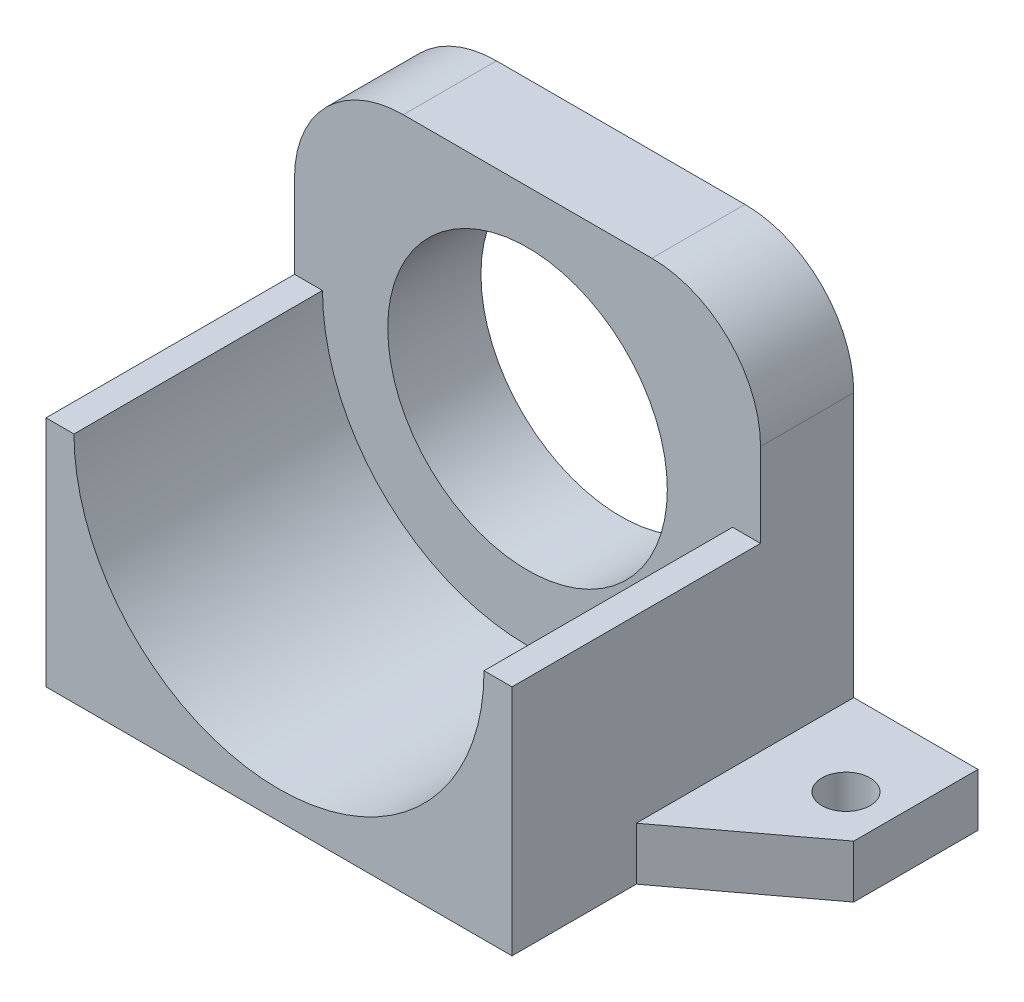
ISO-10303-21;
HEADER;
FILE_DESCRIPTION(('STEP AP214'),'2;1');
FILE_NAME('part.step','',(''),(''),'','','');
FILE_SCHEMA(('AUTOMOTIVE_DESIGN { 1 0 10303 214 1 1 1 1 }'));
ENDSEC;
DATA;
#1=APPLICATION_CONTEXT('core data for automotive mechanical design processes');
#2=APPLICATION_PROTOCOL_DEFINITION('international standard','automotive_design',2000,#1);
#3=PRODUCT_CONTEXT('',#1,'mechanical');
#4=PRODUCT('Part','Part','',(#3));
#5=PRODUCT_RELATED_PRODUCT_CATEGORY('part','',(#4));
#6=PRODUCT_DEFINITION_FORMATION('','',#4);
#7=PRODUCT_DEFINITION_CONTEXT('part definition',#1,'design');
#8=PRODUCT_DEFINITION('design','',#6,#7);
#9=PRODUCT_DEFINITION_SHAPE('','',#8);
#10=(LENGTH_UNIT() NAMED_UNIT(*) SI_UNIT(.MILLI.,.METRE.));
#11=(NAMED_UNIT(*) PLANE_ANGLE_UNIT() SI_UNIT($,.RADIAN.));
#12=(NAMED_UNIT(*) SI_UNIT($,.STERADIAN.) SOLID_ANGLE_UNIT());
#13=UNCERTAINTY_MEASURE_WITH_UNIT(LENGTH_MEASURE(1.E-05),#10,'distance_accuracy_value','');
#14=(GEOMETRIC_REPRESENTATION_CONTEXT(3) GLOBAL_UNCERTAINTY_ASSIGNED_CONTEXT((#13)) GLOBAL_UNIT_ASSIGNED_CONTEXT((#10,
#11,#12)) REPRESENTATION_CONTEXT('',''));
#15=CARTESIAN_POINT('',(0.,0.,0.));
#16=DIRECTION('',(0.,0.,1.));
#17=DIRECTION('',(1.,0.,0.));
#18=AXIS2_PLACEMENT_3D('',#15,#16,#17);
#19=CARTESIAN_POINT('',(15.,27.4,6.));
#20=DIRECTION('',(-1.,0.,0.));
#21=DIRECTION('',(0.,-1.,0.));
#22=AXIS2_PLACEMENT_3D('',#19,#20,#21);
#23=PLANE('',#22);
#24=DIRECTION('',(0.,-1.,0.));
#25=VECTOR('',#24,1.);
#26=CARTESIAN_POINT('',(15.,13.4,14.));
#27=LINE('',#26,#25);
#28=CARTESIAN_POINT('',(15.,3.4,14.));
#29=VERTEX_POINT('',#28);
#30=CARTESIAN_POINT('',(15.,0.,14.));
#31=VERTEX_POINT('',#30);
#32=EDGE_CURVE('E185',#29,#31,#27,.T.);
#33=ORIENTED_EDGE('',*,*,#32,.F.);
#34=DIRECTION('',(0.,0.,-1.));
#35=VECTOR('',#34,1.);
#36=CARTESIAN_POINT('',(15.,3.4,6.));
#37=LINE('',#36,#35);
#38=CARTESIAN_POINT('',(15.,3.4,0.));
#39=VERTEX_POINT('',#38);
#40=EDGE_CURVE('E48',#29,#39,#37,.T.);
#41=ORIENTED_EDGE('',*,*,#40,.T.);
#42=DIRECTION('',(0.,1.,0.));
#43=VECTOR('',#42,1.);
#44=CARTESIAN_POINT('',(15.,27.4,0.));
#45=LINE('',#44,#43);
#46=CARTESIAN_POINT('',(15.,20.4,0.));
#47=VERTEX_POINT('',#46);
#48=EDGE_CURVE('E256',#39,#47,#45,.T.);
#49=ORIENTED_EDGE('',*,*,#48,.T.);
#50=DIRECTION('',(0.,0.,-1.));
#51=VECTOR('',#50,1.);
#52=CARTESIAN_POINT('',(15.,20.4,6.));
#53=LINE('',#52,#51);
#54=CARTESIAN_POINT('',(15.,20.4,6.));
#55=VERTEX_POINT('',#54);
#56=EDGE_CURVE('E11',#47,#55,#53,.F.);
#57=ORIENTED_EDGE('',*,*,#56,.T.);
#58=DIRECTION('',(0.,1.,0.));
#59=VECTOR('',#58,1.);
#60=CARTESIAN_POINT('',(15.,27.4,6.));
#61=LINE('',#60,#59);
#62=CARTESIAN_POINT('',(15.,15.,6.));
#63=VERTEX_POINT('',#62);
#64=EDGE_CURVE('E243',#63,#55,#61,.T.);
#65=ORIENTED_EDGE('',*,*,#64,.F.);
#66=DIRECTION('',(0.,0.,-1.));
#67=VECTOR('',#66,1.);
#68=CARTESIAN_POINT('',(15.,15.,22.));
#69=LINE('',#68,#67);
#70=CARTESIAN_POINT('',(15.,15.,22.));
#71=VERTEX_POINT('',#70);
#72=EDGE_CURVE('E229',#71,#63,#69,.T.);
#73=ORIENTED_EDGE('',*,*,#72,.F.);
#74=DIRECTION('',(0.,1.,0.));
#75=VECTOR('',#74,1.);
#76=CARTESIAN_POINT('',(15.,0.,22.));
#77=LINE('',#76,#75);
#78=CARTESIAN_POINT('',(15.,0.,22.));
#79=VERTEX_POINT('',#78);
#80=EDGE_CURVE('E205',#79,#71,#77,.T.);
#81=ORIENTED_EDGE('',*,*,#80,.F.);
#82=DIRECTION('',(0.,0.,-1.));
#83=VECTOR('',#82,1.);
#84=CARTESIAN_POINT('',(15.,0.,22.));
#85=LINE('',#84,#83);
#86=EDGE_CURVE('E55',#79,#31,#85,.T.);
#87=ORIENTED_EDGE('',*,*,#86,.T.);
#88=EDGE_LOOP('',(#33,#41,#49,#57,#65,#73,#81,#87));
#89=FACE_BOUND('',#88,.T.);
#90=ADVANCED_FACE('F33',(#89),#23,.F.);
#91=CARTESIAN_POINT('',(-15.,3.4,6.));
#92=DIRECTION('',(1.,0.,0.));
#93=DIRECTION('',(0.,1.,0.));
#94=AXIS2_PLACEMENT_3D('',#91,#92,#93);
#95=PLANE('',#94);
#96=DIRECTION('',(0.,-1.,0.));
#97=VECTOR('',#96,1.);
#98=CARTESIAN_POINT('',(-15.,13.4,14.));
#99=LINE('',#98,#97);
#100=CARTESIAN_POINT('',(-15.,3.4,14.));
#101=VERTEX_POINT('',#100);
#102=CARTESIAN_POINT('',(-15.,0.,14.));
#103=VERTEX_POINT('',#102);
#104=EDGE_CURVE('E175',#101,#103,#99,.T.);
#105=ORIENTED_EDGE('',*,*,#104,.T.);
#106=DIRECTION('',(0.,0.,-1.));
#107=VECTOR('',#106,1.);
#108=CARTESIAN_POINT('',(-15.,0.,22.));
#109=LINE('',#108,#107);
#110=CARTESIAN_POINT('',(-15.,0.,22.));
#111=VERTEX_POINT('',#110);
#112=EDGE_CURVE('E233',#111,#103,#109,.T.);
#113=ORIENTED_EDGE('',*,*,#112,.F.);
#114=DIRECTION('',(0.,-1.,0.));
#115=VECTOR('',#114,1.);
#116=CARTESIAN_POINT('',(-15.,0.,22.));
#117=LINE('',#116,#115);
#118=CARTESIAN_POINT('',(-15.,15.,22.));
#119=VERTEX_POINT('',#118);
#120=EDGE_CURVE('E199',#119,#111,#117,.T.);
#121=ORIENTED_EDGE('',*,*,#120,.F.);
#122=DIRECTION('',(0.,0.,-1.));
#123=VECTOR('',#122,1.);
#124=CARTESIAN_POINT('',(-15.,15.,22.));
#125=LINE('',#124,#123);
#126=CARTESIAN_POINT('',(-15.,15.,6.));
#127=VERTEX_POINT('',#126);
#128=EDGE_CURVE('E213',#119,#127,#125,.T.);
#129=ORIENTED_EDGE('',*,*,#128,.T.);
#130=DIRECTION('',(0.,-1.,0.));
#131=VECTOR('',#130,1.);
#132=CARTESIAN_POINT('',(-15.,3.4,6.));
#133=LINE('',#132,#131);
#134=CARTESIAN_POINT('',(-15.,20.4,6.));
#135=VERTEX_POINT('',#134);
#136=EDGE_CURVE('E172',#135,#127,#133,.T.);
#137=ORIENTED_EDGE('',*,*,#136,.F.);
#138=DIRECTION('',(0.,0.,-1.));
#139=VECTOR('',#138,1.);
#140=CARTESIAN_POINT('',(-15.,20.4,6.));
#141=LINE('',#140,#139);
#142=CARTESIAN_POINT('',(-15.,20.4,0.));
#143=VERTEX_POINT('',#142);
#144=EDGE_CURVE('E274',#135,#143,#141,.T.);
#145=ORIENTED_EDGE('',*,*,#144,.T.);
#146=DIRECTION('',(0.,-1.,0.));
#147=VECTOR('',#146,1.);
#148=CARTESIAN_POINT('',(-15.,3.4,0.));
#149=LINE('',#148,#147);
#150=CARTESIAN_POINT('',(-15.,3.4,0.));
#151=VERTEX_POINT('',#150);
#152=EDGE_CURVE('E262',#143,#151,#149,.T.);
#153=ORIENTED_EDGE('',*,*,#152,.T.);
#154=DIRECTION('',(0.,0.,-1.));
#155=VECTOR('',#154,1.);
#156=CARTESIAN_POINT('',(-15.,3.4,6.));
#157=LINE('',#156,#155);
#158=EDGE_CURVE('E171',#101,#151,#157,.T.);
#159=ORIENTED_EDGE('',*,*,#158,.F.);
#160=EDGE_LOOP('',(#105,#113,#121,#129,#137,#145,#153,#159));
#161=FACE_BOUND('',#160,.T.);
#162=ADVANCED_FACE('F296',(#161),#95,.F.);
#163=CARTESIAN_POINT('',(0.,0.,6.));
#164=DIRECTION('',(0.,0.,-1.));
#165=DIRECTION('',(-1.,0.,0.));
#166=AXIS2_PLACEMENT_3D('',#163,#164,#165);
#167=PLANE('',#166);
#168=CARTESIAN_POINT('',(0.,15.,6.));
#169=DIRECTION('',(0.,0.,-1.));
#170=DIRECTION('',(-1.,0.,0.));
#171=AXIS2_PLACEMENT_3D('',#168,#169,#170);
#172=CIRCLE('',#171,9.);
#173=CARTESIAN_POINT('',(-9.,15.,6.));
#174=VERTEX_POINT('',#173);
#175=EDGE_CURVE('E239',#174,#174,#172,.F.);
#176=ORIENTED_EDGE('',*,*,#175,.F.);
#177=EDGE_LOOP('',(#176));
#178=FACE_BOUND('',#177,.T.);
#179=DIRECTION('',(-1.,0.,0.));
#180=VECTOR('',#179,1.);
#181=CARTESIAN_POINT('',(-15.,15.,6.));
#182=LINE('',#181,#180);
#183=CARTESIAN_POINT('',(-13.2,15.,6.));
#184=VERTEX_POINT('',#183);
#185=EDGE_CURVE('E203',#184,#127,#182,.T.);
#186=ORIENTED_EDGE('',*,*,#185,.F.);
#187=CARTESIAN_POINT('',(0.,15.,6.));
#188=DIRECTION('',(0.,0.,-1.));
#189=DIRECTION('',(1.,0.,0.));
#190=AXIS2_PLACEMENT_3D('',#187,#188,#189);
#191=CIRCLE('',#190,13.2);
#192=CARTESIAN_POINT('',(13.2,15.,6.));
#193=VERTEX_POINT('',#192);
#194=EDGE_CURVE('E216',#193,#184,#191,.T.);
#195=ORIENTED_EDGE('',*,*,#194,.F.);
#196=DIRECTION('',(-1.,0.,0.));
#197=VECTOR('',#196,1.);
#198=CARTESIAN_POINT('',(15.,15.,6.));
#199=LINE('',#198,#197);
#200=EDGE_CURVE('E160',#63,#193,#199,.T.);
#201=ORIENTED_EDGE('',*,*,#200,.F.);
#202=ORIENTED_EDGE('',*,*,#64,.T.);
#203=CARTESIAN_POINT('',(8.,20.4,6.));
#204=DIRECTION('',(0.,0.,-1.));
#205=DIRECTION('',(-1.,0.,0.));
#206=AXIS2_PLACEMENT_3D('',#203,#204,#205);
#207=CIRCLE('',#206,7.);
#208=CARTESIAN_POINT('',(8.,27.4,6.));
#209=VERTEX_POINT('',#208);
#210=EDGE_CURVE('E286',#55,#209,#207,.F.);
#211=ORIENTED_EDGE('',*,*,#210,.T.);
#212=DIRECTION('',(-1.,0.,0.));
#213=VECTOR('',#212,1.);
#214=CARTESIAN_POINT('',(-15.,27.4,6.));
#215=LINE('',#214,#213);
#216=CARTESIAN_POINT('',(-8.,27.4,6.));
#217=VERTEX_POINT('',#216);
#218=EDGE_CURVE('E245',#209,#217,#215,.T.);
#219=ORIENTED_EDGE('',*,*,#218,.T.);
#220=CARTESIAN_POINT('',(-8.,20.4,6.));
#221=DIRECTION('',(0.,0.,-1.));
#222=DIRECTION('',(-1.,0.,0.));
#223=AXIS2_PLACEMENT_3D('',#220,#221,#222);
#224=CIRCLE('',#223,7.);
#225=EDGE_CURVE('E41',#217,#135,#224,.F.);
#226=ORIENTED_EDGE('',*,*,#225,.T.);
#227=ORIENTED_EDGE('',*,*,#136,.T.);
#228=EDGE_LOOP('',(#186,#195,#201,#202,#211,#219,#226,#227));
#229=FACE_BOUND('',#228,.T.);
#230=ADVANCED_FACE('F290',(#178,#229),#167,.F.);
#231=CARTESIAN_POINT('',(-23.,0.,6.));
#232=DIRECTION('',(1.,0.,0.));
#233=DIRECTION('',(0.,0.,-1.));
#234=AXIS2_PLACEMENT_3D('',#231,#232,#233);
#235=PLANE('',#234);
#236=DIRECTION('',(0.,-1.,0.));
#237=VECTOR('',#236,1.);
#238=CARTESIAN_POINT('',(-23.,0.,0.));
#239=LINE('',#238,#237);
#240=CARTESIAN_POINT('',(-23.,3.4,0.));
#241=VERTEX_POINT('',#240);
#242=CARTESIAN_POINT('',(-23.,0.,0.));
#243=VERTEX_POINT('',#242);
#244=EDGE_CURVE('E242',#241,#243,#239,.T.);
#245=ORIENTED_EDGE('',*,*,#244,.T.);
#246=DIRECTION('',(0.,0.,-1.));
#247=VECTOR('',#246,1.);
#248=CARTESIAN_POINT('',(-23.,0.,6.));
#249=LINE('',#248,#247);
#250=CARTESIAN_POINT('',(-23.,0.,8.));
#251=VERTEX_POINT('',#250);
#252=EDGE_CURVE('E155',#251,#243,#249,.T.);
#253=ORIENTED_EDGE('',*,*,#252,.F.);
#254=DIRECTION('',(0.,-1.,0.));
#255=VECTOR('',#254,1.);
#256=CARTESIAN_POINT('',(-23.,3.4,8.));
#257=LINE('',#256,#255);
#258=CARTESIAN_POINT('',(-23.,3.4,8.));
#259=VERTEX_POINT('',#258);
#260=EDGE_CURVE('E148',#259,#251,#257,.T.);
#261=ORIENTED_EDGE('',*,*,#260,.F.);
#262=DIRECTION('',(0.,0.,-1.));
#263=VECTOR('',#262,1.);
#264=CARTESIAN_POINT('',(-23.,3.4,6.));
#265=LINE('',#264,#263);
#266=EDGE_CURVE('E152',#259,#241,#265,.T.);
#267=ORIENTED_EDGE('',*,*,#266,.T.);
#268=EDGE_LOOP('',(#245,#253,#261,#267));
#269=FACE_BOUND('',#268,.T.);
#270=ADVANCED_FACE('F151',(#269),#235,.F.);
#271=CARTESIAN_POINT('',(-23.,0.,6.));
#272=DIRECTION('',(0.,1.,0.));
#273=DIRECTION('',(0.,0.,1.));
#274=AXIS2_PLACEMENT_3D('',#271,#272,#273);
#275=PLANE('',#274);
#276=DIRECTION('',(0.8,0.,-0.6));
#277=VECTOR('',#276,1.);
#278=CARTESIAN_POINT('',(15.,0.,14.));
#279=LINE('',#278,#277);
#280=CARTESIAN_POINT('',(23.,0.,8.));
#281=VERTEX_POINT('',#280);
#282=EDGE_CURVE('E316',#31,#281,#279,.T.);
#283=ORIENTED_EDGE('',*,*,#282,.F.);
#284=ORIENTED_EDGE('',*,*,#86,.F.);
#285=DIRECTION('',(1.,0.,0.));
#286=VECTOR('',#285,1.);
#287=CARTESIAN_POINT('',(-15.,0.,22.));
#288=LINE('',#287,#286);
#289=EDGE_CURVE('E202',#111,#79,#288,.T.);
#290=ORIENTED_EDGE('',*,*,#289,.F.);
#291=ORIENTED_EDGE('',*,*,#112,.T.);
#292=DIRECTION('',(0.8,0.,0.6));
#293=VECTOR('',#292,1.);
#294=CARTESIAN_POINT('',(-23.,0.,8.));
#295=LINE('',#294,#293);
#296=EDGE_CURVE('E181',#251,#103,#295,.T.);
#297=ORIENTED_EDGE('',*,*,#296,.F.);
#298=ORIENTED_EDGE('',*,*,#252,.T.);
#299=DIRECTION('',(1.,0.,0.));
#300=VECTOR('',#299,1.);
#301=CARTESIAN_POINT('',(-23.,0.,0.));
#302=LINE('',#301,#300);
#303=CARTESIAN_POINT('',(23.,0.,0.));
#304=VERTEX_POINT('',#303);
#305=EDGE_CURVE('E250',#243,#304,#302,.T.);
#306=ORIENTED_EDGE('',*,*,#305,.T.);
#307=DIRECTION('',(0.,0.,-1.));
#308=VECTOR('',#307,1.);
#309=CARTESIAN_POINT('',(23.,0.,6.));
#310=LINE('',#309,#308);
#311=EDGE_CURVE('E270',#281,#304,#310,.T.);
#312=ORIENTED_EDGE('',*,*,#311,.F.);
#313=EDGE_LOOP('',(#283,#284,#290,#291,#297,#298,#306,#312));
#314=FACE_BOUND('',#313,.T.);
#315=CARTESIAN_POINT('',(20.,0.,5.5));
#316=DIRECTION('',(0.,1.,0.));
#317=DIRECTION('',(0.,0.,1.));
#318=AXIS2_PLACEMENT_3D('',#315,#316,#317);
#319=CIRCLE('',#318,1.55);
#320=CARTESIAN_POINT('',(20.,0.,7.05));
#321=VERTEX_POINT('',#320);
#322=EDGE_CURVE('E189',#321,#321,#319,.T.);
#323=ORIENTED_EDGE('',*,*,#322,.T.);
#324=EDGE_LOOP('',(#323));
#325=FACE_BOUND('',#324,.T.);
#326=CARTESIAN_POINT('',(-20.,0.,5.5));
#327=DIRECTION('',(0.,1.,0.));
#328=DIRECTION('',(0.,0.,1.));
#329=AXIS2_PLACEMENT_3D('',#326,#327,#328);
#330=CIRCLE('',#329,1.55);
#331=CARTESIAN_POINT('',(-20.,0.,7.05));
#332=VERTEX_POINT('',#331);
#333=EDGE_CURVE('E179',#332,#332,#330,.T.);
#334=ORIENTED_EDGE('',*,*,#333,.T.);
#335=EDGE_LOOP('',(#334));
#336=FACE_BOUND('',#335,.T.);
#337=ADVANCED_FACE('F321',(#314,#325,#336),#275,.F.);
#338=CARTESIAN_POINT('',(23.,0.,6.));
#339=DIRECTION('',(-1.,0.,0.));
#340=DIRECTION('',(0.,0.,1.));
#341=AXIS2_PLACEMENT_3D('',#338,#339,#340);
#342=PLANE('',#341);
#343=DIRECTION('',(0.,1.,0.));
#344=VECTOR('',#343,1.);
#345=CARTESIAN_POINT('',(23.,0.,0.));
#346=LINE('',#345,#344);
#347=CARTESIAN_POINT('',(23.,3.4,0.));
#348=VERTEX_POINT('',#347);
#349=EDGE_CURVE('E252',#304,#348,#346,.T.);
#350=ORIENTED_EDGE('',*,*,#349,.T.);
#351=DIRECTION('',(0.,0.,-1.));
#352=VECTOR('',#351,1.);
#353=CARTESIAN_POINT('',(23.,3.4,6.));
#354=LINE('',#353,#352);
#355=CARTESIAN_POINT('',(23.,3.4,8.));
#356=VERTEX_POINT('',#355);
#357=EDGE_CURVE('E267',#356,#348,#354,.T.);
#358=ORIENTED_EDGE('',*,*,#357,.F.);
#359=DIRECTION('',(0.,1.,0.));
#360=VECTOR('',#359,1.);
#361=CARTESIAN_POINT('',(23.,3.4,8.));
#362=LINE('',#361,#360);
#363=EDGE_CURVE('E161',#281,#356,#362,.T.);
#364=ORIENTED_EDGE('',*,*,#363,.F.);
#365=ORIENTED_EDGE('',*,*,#311,.T.);
#366=EDGE_LOOP('',(#350,#358,#364,#365));
#367=FACE_BOUND('',#366,.T.);
#368=ADVANCED_FACE('F325',(#367),#342,.F.);
#369=CARTESIAN_POINT('',(23.,3.4,6.));
#370=DIRECTION('',(0.,-1.,0.));
#371=DIRECTION('',(0.,0.,-1.));
#372=AXIS2_PLACEMENT_3D('',#369,#370,#371);
#373=PLANE('',#372);
#374=CARTESIAN_POINT('',(20.,3.4,5.5));
#375=DIRECTION('',(0.,1.,0.));
#376=DIRECTION('',(0.,0.,1.));
#377=AXIS2_PLACEMENT_3D('',#374,#375,#376);
#378=CIRCLE('',#377,1.55);
#379=CARTESIAN_POINT('',(20.,3.4,7.05));
#380=VERTEX_POINT('',#379);
#381=EDGE_CURVE('E192',#380,#380,#378,.T.);
#382=ORIENTED_EDGE('',*,*,#381,.F.);
#383=EDGE_LOOP('',(#382));
#384=FACE_BOUND('',#383,.T.);
#385=DIRECTION('',(-1.,0.,0.));
#386=VECTOR('',#385,1.);
#387=CARTESIAN_POINT('',(23.,3.4,0.));
#388=LINE('',#387,#386);
#389=EDGE_CURVE('E254',#348,#39,#388,.T.);
#390=ORIENTED_EDGE('',*,*,#389,.T.);
#391=ORIENTED_EDGE('',*,*,#40,.F.);
#392=DIRECTION('',(-0.8,0.,0.6));
#393=VECTOR('',#392,1.);
#394=CARTESIAN_POINT('',(15.,3.4,14.));
#395=LINE('',#394,#393);
#396=EDGE_CURVE('E187',#356,#29,#395,.T.);
#397=ORIENTED_EDGE('',*,*,#396,.F.);
#398=ORIENTED_EDGE('',*,*,#357,.T.);
#399=EDGE_LOOP('',(#390,#391,#397,#398));
#400=FACE_BOUND('',#399,.T.);
#401=ADVANCED_FACE('F326',(#384,#400),#373,.F.);
#402=CARTESIAN_POINT('',(-15.,27.4,6.));
#403=DIRECTION('',(0.,-1.,0.));
#404=DIRECTION('',(0.,0.,-1.));
#405=AXIS2_PLACEMENT_3D('',#402,#403,#404);
#406=PLANE('',#405);
#407=DIRECTION('',(-1.,0.,0.));
#408=VECTOR('',#407,1.);
#409=CARTESIAN_POINT('',(-15.,27.4,0.));
#410=LINE('',#409,#408);
#411=CARTESIAN_POINT('',(8.,27.4,0.));
#412=VERTEX_POINT('',#411);
#413=CARTESIAN_POINT('',(-8.,27.4,0.));
#414=VERTEX_POINT('',#413);
#415=EDGE_CURVE('E259',#412,#414,#410,.T.);
#416=ORIENTED_EDGE('',*,*,#415,.T.);
#417=DIRECTION('',(0.,0.,-1.));
#418=VECTOR('',#417,1.);
#419=CARTESIAN_POINT('',(-8.,27.4,6.));
#420=LINE('',#419,#418);
#421=EDGE_CURVE('E284',#414,#217,#420,.F.);
#422=ORIENTED_EDGE('',*,*,#421,.T.);
#423=ORIENTED_EDGE('',*,*,#218,.F.);
#424=DIRECTION('',(0.,0.,-1.));
#425=VECTOR('',#424,1.);
#426=CARTESIAN_POINT('',(8.,27.4,6.));
#427=LINE('',#426,#425);
#428=EDGE_CURVE('E281',#209,#412,#427,.T.);
#429=ORIENTED_EDGE('',*,*,#428,.T.);
#430=EDGE_LOOP('',(#416,#422,#423,#429));
#431=FACE_BOUND('',#430,.T.);
#432=ADVANCED_FACE('F305',(#431),#406,.F.);
#433=CARTESIAN_POINT('',(-23.,3.4,6.));
#434=DIRECTION('',(0.,-1.,0.));
#435=DIRECTION('',(0.,0.,-1.));
#436=AXIS2_PLACEMENT_3D('',#433,#434,#435);
#437=PLANE('',#436);
#438=CARTESIAN_POINT('',(-20.,3.4,5.5));
#439=DIRECTION('',(0.,1.,0.));
#440=DIRECTION('',(0.,0.,1.));
#441=AXIS2_PLACEMENT_3D('',#438,#439,#440);
#442=CIRCLE('',#441,1.55);
#443=CARTESIAN_POINT('',(-20.,3.4,7.05));
#444=VERTEX_POINT('',#443);
#445=EDGE_CURVE('E176',#444,#444,#442,.T.);
#446=ORIENTED_EDGE('',*,*,#445,.F.);
#447=EDGE_LOOP('',(#446));
#448=FACE_BOUND('',#447,.T.);
#449=DIRECTION('',(-1.,0.,0.));
#450=VECTOR('',#449,1.);
#451=CARTESIAN_POINT('',(-23.,3.4,0.));
#452=LINE('',#451,#450);
#453=EDGE_CURVE('E170',#151,#241,#452,.T.);
#454=ORIENTED_EDGE('',*,*,#453,.T.);
#455=ORIENTED_EDGE('',*,*,#266,.F.);
#456=DIRECTION('',(-0.8,0.,-0.6));
#457=VECTOR('',#456,1.);
#458=CARTESIAN_POINT('',(-23.,3.4,8.));
#459=LINE('',#458,#457);
#460=EDGE_CURVE('E167',#101,#259,#459,.T.);
#461=ORIENTED_EDGE('',*,*,#460,.F.);
#462=ORIENTED_EDGE('',*,*,#158,.T.);
#463=EDGE_LOOP('',(#454,#455,#461,#462));
#464=FACE_BOUND('',#463,.T.);
#465=ADVANCED_FACE('F165',(#448,#464),#437,.F.);
#466=CARTESIAN_POINT('',(0.,0.,0.));
#467=DIRECTION('',(0.,0.,-1.));
#468=DIRECTION('',(-1.,0.,0.));
#469=AXIS2_PLACEMENT_3D('',#466,#467,#468);
#470=PLANE('',#469);
#471=CARTESIAN_POINT('',(0.,15.,0.));
#472=DIRECTION('',(0.,0.,-1.));
#473=DIRECTION('',(-1.,0.,0.));
#474=AXIS2_PLACEMENT_3D('',#471,#472,#473);
#475=CIRCLE('',#474,9.);
#476=CARTESIAN_POINT('',(-9.,15.,0.));
#477=VERTEX_POINT('',#476);
#478=EDGE_CURVE('E236',#477,#477,#475,.T.);
#479=ORIENTED_EDGE('',*,*,#478,.F.);
#480=EDGE_LOOP('',(#479));
#481=FACE_BOUND('',#480,.T.);
#482=ORIENTED_EDGE('',*,*,#152,.F.);
#483=CARTESIAN_POINT('',(-8.,20.4,0.));
#484=DIRECTION('',(0.,0.,-1.));
#485=DIRECTION('',(-1.,0.,0.));
#486=AXIS2_PLACEMENT_3D('',#483,#484,#485);
#487=CIRCLE('',#486,7.);
#488=EDGE_CURVE('E279',#143,#414,#487,.T.);
#489=ORIENTED_EDGE('',*,*,#488,.T.);
#490=ORIENTED_EDGE('',*,*,#415,.F.);
#491=CARTESIAN_POINT('',(8.,20.4,0.));
#492=DIRECTION('',(0.,0.,-1.));
#493=DIRECTION('',(-1.,0.,0.));
#494=AXIS2_PLACEMENT_3D('',#491,#492,#493);
#495=CIRCLE('',#494,7.);
#496=EDGE_CURVE('E277',#412,#47,#495,.T.);
#497=ORIENTED_EDGE('',*,*,#496,.T.);
#498=ORIENTED_EDGE('',*,*,#48,.F.);
#499=ORIENTED_EDGE('',*,*,#389,.F.);
#500=ORIENTED_EDGE('',*,*,#349,.F.);
#501=ORIENTED_EDGE('',*,*,#305,.F.);
#502=ORIENTED_EDGE('',*,*,#244,.F.);
#503=ORIENTED_EDGE('',*,*,#453,.F.);
#504=EDGE_LOOP('',(#482,#489,#490,#497,#498,#499,#500,#501,#502,#503));
#505=FACE_BOUND('',#504,.T.);
#506=ADVANCED_FACE('F303',(#481,#505),#470,.T.);
#507=CARTESIAN_POINT('',(0.,15.,31.4558441227157));
#508=DIRECTION('',(0.,0.,-1.));
#509=DIRECTION('',(-1.,0.,0.));
#510=AXIS2_PLACEMENT_3D('',#507,#508,#509);
#511=CYLINDRICAL_SURFACE('',#510,9.);
#512=ORIENTED_EDGE('',*,*,#175,.T.);
#513=EDGE_LOOP('',(#512));
#514=FACE_BOUND('',#513,.T.);
#515=ORIENTED_EDGE('',*,*,#478,.T.);
#516=EDGE_LOOP('',(#515));
#517=FACE_BOUND('',#516,.T.);
#518=ADVANCED_FACE('F368',(#514,#517),#511,.F.);
#519=CARTESIAN_POINT('',(-8.,20.4,6.));
#520=DIRECTION('',(0.,0.,-1.));
#521=DIRECTION('',(-1.,0.,0.));
#522=AXIS2_PLACEMENT_3D('',#519,#520,#521);
#523=CYLINDRICAL_SURFACE('',#522,7.);
#524=ORIENTED_EDGE('',*,*,#225,.F.);
#525=ORIENTED_EDGE('',*,*,#421,.F.);
#526=ORIENTED_EDGE('',*,*,#488,.F.);
#527=ORIENTED_EDGE('',*,*,#144,.F.);
#528=EDGE_LOOP('',(#524,#525,#526,#527));
#529=FACE_BOUND('',#528,.T.);
#530=ADVANCED_FACE('F300',(#529),#523,.T.);
#531=CARTESIAN_POINT('',(8.,20.4,6.));
#532=DIRECTION('',(0.,0.,-1.));
#533=DIRECTION('',(-1.,0.,0.));
#534=AXIS2_PLACEMENT_3D('',#531,#532,#533);
#535=CYLINDRICAL_SURFACE('',#534,7.);
#536=ORIENTED_EDGE('',*,*,#210,.F.);
#537=ORIENTED_EDGE('',*,*,#56,.F.);
#538=ORIENTED_EDGE('',*,*,#496,.F.);
#539=ORIENTED_EDGE('',*,*,#428,.F.);
#540=EDGE_LOOP('',(#536,#537,#538,#539));
#541=FACE_BOUND('',#540,.T.);
#542=ADVANCED_FACE('F35',(#541),#535,.T.);
#543=CARTESIAN_POINT('',(15.,15.,22.));
#544=DIRECTION('',(0.,-1.,0.));
#545=DIRECTION('',(0.,0.,-1.));
#546=AXIS2_PLACEMENT_3D('',#543,#544,#545);
#547=PLANE('',#546);
#548=ORIENTED_EDGE('',*,*,#200,.T.);
#549=DIRECTION('',(0.,0.,-1.));
#550=VECTOR('',#549,1.);
#551=CARTESIAN_POINT('',(13.2,15.,22.));
#552=LINE('',#551,#550);
#553=CARTESIAN_POINT('',(13.2,15.,22.));
#554=VERTEX_POINT('',#553);
#555=EDGE_CURVE('E226',#554,#193,#552,.T.);
#556=ORIENTED_EDGE('',*,*,#555,.F.);
#557=DIRECTION('',(-1.,0.,0.));
#558=VECTOR('',#557,1.);
#559=CARTESIAN_POINT('',(15.,15.,22.));
#560=LINE('',#559,#558);
#561=EDGE_CURVE('E207',#71,#554,#560,.T.);
#562=ORIENTED_EDGE('',*,*,#561,.F.);
#563=ORIENTED_EDGE('',*,*,#72,.T.);
#564=EDGE_LOOP('',(#548,#556,#562,#563));
#565=FACE_BOUND('',#564,.T.);
#566=ADVANCED_FACE('F341',(#565),#547,.F.);
#567=CARTESIAN_POINT('',(0.,15.,22.));
#568=DIRECTION('',(0.,0.,-1.));
#569=DIRECTION('',(-1.,0.,0.));
#570=AXIS2_PLACEMENT_3D('',#567,#568,#569);
#571=CYLINDRICAL_SURFACE('',#570,13.2);
#572=ORIENTED_EDGE('',*,*,#194,.T.);
#573=DIRECTION('',(0.,0.,-1.));
#574=VECTOR('',#573,1.);
#575=CARTESIAN_POINT('',(-13.2,15.,22.));
#576=LINE('',#575,#574);
#577=CARTESIAN_POINT('',(-13.2,15.,22.));
#578=VERTEX_POINT('',#577);
#579=EDGE_CURVE('E223',#578,#184,#576,.T.);
#580=ORIENTED_EDGE('',*,*,#579,.F.);
#581=CARTESIAN_POINT('',(0.,15.,22.));
#582=DIRECTION('',(0.,0.,-1.));
#583=DIRECTION('',(1.,0.,0.));
#584=AXIS2_PLACEMENT_3D('',#581,#582,#583);
#585=CIRCLE('',#584,13.2);
#586=EDGE_CURVE('E209',#554,#578,#585,.T.);
#587=ORIENTED_EDGE('',*,*,#586,.F.);
#588=ORIENTED_EDGE('',*,*,#555,.T.);
#589=EDGE_LOOP('',(#572,#580,#587,#588));
#590=FACE_BOUND('',#589,.T.);
#591=ADVANCED_FACE('F337',(#590),#571,.F.);
#592=CARTESIAN_POINT('',(-15.,15.,22.));
#593=DIRECTION('',(0.,-1.,0.));
#594=DIRECTION('',(0.,0.,-1.));
#595=AXIS2_PLACEMENT_3D('',#592,#593,#594);
#596=PLANE('',#595);
#597=ORIENTED_EDGE('',*,*,#185,.T.);
#598=ORIENTED_EDGE('',*,*,#128,.F.);
#599=DIRECTION('',(-1.,0.,0.));
#600=VECTOR('',#599,1.);
#601=CARTESIAN_POINT('',(-15.,15.,22.));
#602=LINE('',#601,#600);
#603=EDGE_CURVE('E211',#578,#119,#602,.T.);
#604=ORIENTED_EDGE('',*,*,#603,.F.);
#605=ORIENTED_EDGE('',*,*,#579,.T.);
#606=EDGE_LOOP('',(#597,#598,#604,#605));
#607=FACE_BOUND('',#606,.T.);
#608=ADVANCED_FACE('F334',(#607),#596,.F.);
#609=CARTESIAN_POINT('',(0.,15.,22.));
#610=DIRECTION('',(0.,0.,1.));
#611=DIRECTION('',(1.,0.,0.));
#612=AXIS2_PLACEMENT_3D('',#609,#610,#611);
#613=PLANE('',#612);
#614=ORIENTED_EDGE('',*,*,#120,.T.);
#615=ORIENTED_EDGE('',*,*,#289,.T.);
#616=ORIENTED_EDGE('',*,*,#80,.T.);
#617=ORIENTED_EDGE('',*,*,#561,.T.);
#618=ORIENTED_EDGE('',*,*,#586,.T.);
#619=ORIENTED_EDGE('',*,*,#603,.T.);
#620=EDGE_LOOP('',(#614,#615,#616,#617,#618,#619));
#621=FACE_BOUND('',#620,.T.);
#622=ADVANCED_FACE('F329',(#621),#613,.T.);
#623=CARTESIAN_POINT('',(-20.,0.,5.5));
#624=DIRECTION('',(0.,1.,0.));
#625=DIRECTION('',(0.,0.,1.));
#626=AXIS2_PLACEMENT_3D('',#623,#624,#625);
#627=CYLINDRICAL_SURFACE('',#626,1.55);
#628=ORIENTED_EDGE('',*,*,#333,.F.);
#629=EDGE_LOOP('',(#628));
#630=FACE_BOUND('',#629,.T.);
#631=ORIENTED_EDGE('',*,*,#445,.T.);
#632=EDGE_LOOP('',(#631));
#633=FACE_BOUND('',#632,.T.);
#634=ADVANCED_FACE('F390',(#630,#633),#627,.F.);
#635=CARTESIAN_POINT('',(20.,0.,5.5));
#636=DIRECTION('',(0.,1.,0.));
#637=DIRECTION('',(0.,0.,1.));
#638=AXIS2_PLACEMENT_3D('',#635,#636,#637);
#639=CYLINDRICAL_SURFACE('',#638,1.55);
#640=ORIENTED_EDGE('',*,*,#322,.F.);
#641=EDGE_LOOP('',(#640));
#642=FACE_BOUND('',#641,.T.);
#643=ORIENTED_EDGE('',*,*,#381,.T.);
#644=EDGE_LOOP('',(#643));
#645=FACE_BOUND('',#644,.T.);
#646=ADVANCED_FACE('F392',(#642,#645),#639,.F.);
#647=CARTESIAN_POINT('',(-23.,13.4,8.));
#648=DIRECTION('',(0.6,0.,-0.8));
#649=DIRECTION('',(-0.8,0.,-0.6));
#650=AXIS2_PLACEMENT_3D('',#647,#648,#649);
#651=PLANE('',#650);
#652=ORIENTED_EDGE('',*,*,#104,.F.);
#653=ORIENTED_EDGE('',*,*,#460,.T.);
#654=ORIENTED_EDGE('',*,*,#260,.T.);
#655=ORIENTED_EDGE('',*,*,#296,.T.);
#656=EDGE_LOOP('',(#652,#653,#654,#655));
#657=FACE_BOUND('',#656,.T.);
#658=ADVANCED_FACE('F174',(#657),#651,.F.);
#659=CARTESIAN_POINT('',(15.,13.4,14.));
#660=DIRECTION('',(-0.6,0.,-0.8));
#661=DIRECTION('',(-0.8,0.,0.6));
#662=AXIS2_PLACEMENT_3D('',#659,#660,#661);
#663=PLANE('',#662);
#664=ORIENTED_EDGE('',*,*,#363,.T.);
#665=ORIENTED_EDGE('',*,*,#396,.T.);
#666=ORIENTED_EDGE('',*,*,#32,.T.);
#667=ORIENTED_EDGE('',*,*,#282,.T.);
#668=EDGE_LOOP('',(#664,#665,#666,#667));
#669=FACE_BOUND('',#668,.T.);
#670=ADVANCED_FACE('F317',(#669),#663,.F.);
#671=CLOSED_SHELL('',(#90,#162,#230,#270,#337,#368,#401,#432,#465,#506,#518,#530,#542,#566,#591,
#608,#622,#634,#646,#658,#670));
#672=MANIFOLD_SOLID_BREP('B2',#671);
#673=ADVANCED_BREP_SHAPE_REPRESENTATION('',(#18,#672),#14);
#674=SHAPE_DEFINITION_REPRESENTATION(#9,#673);
ENDSEC;
END-ISO-10303-21;
